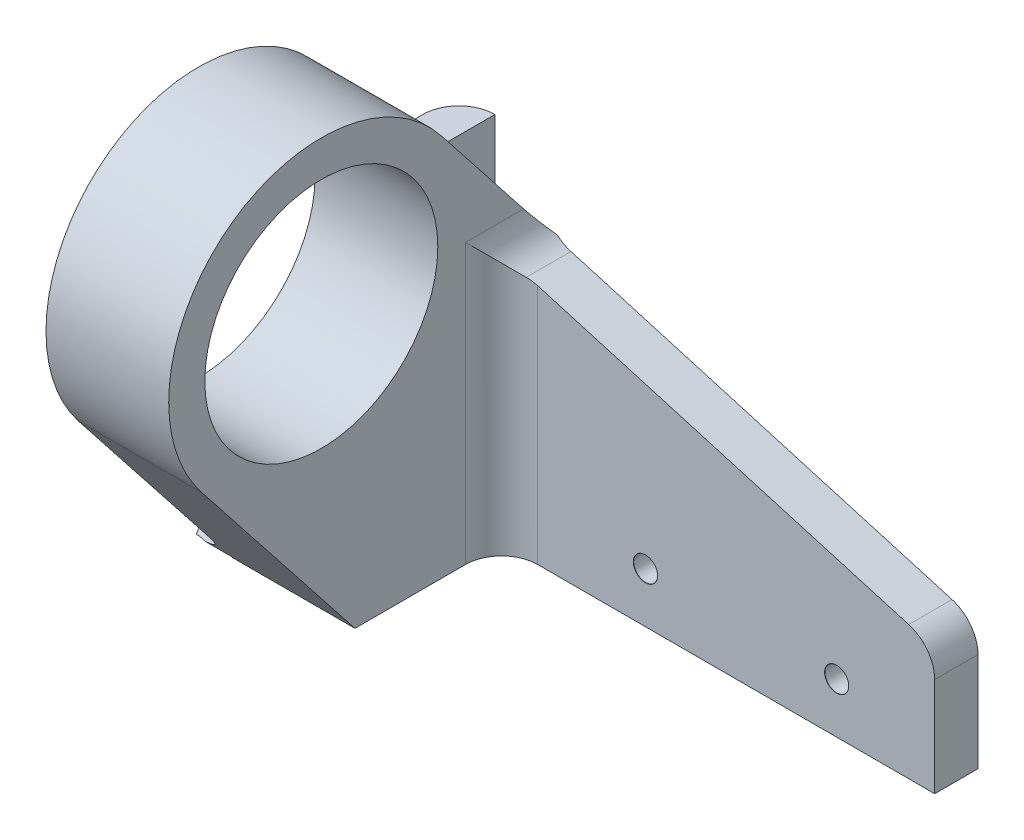
ISO-10303-21;
HEADER;
FILE_DESCRIPTION(('STEP AP214'),'2;1');
FILE_NAME('part.step','',(''),(''),'','','');
FILE_SCHEMA(('AUTOMOTIVE_DESIGN { 1 0 10303 214 1 1 1 1 }'));
ENDSEC;
DATA;
#1=APPLICATION_CONTEXT('core data for automotive mechanical design processes');
#2=APPLICATION_PROTOCOL_DEFINITION('international standard','automotive_design',2000,#1);
#3=PRODUCT_CONTEXT('',#1,'mechanical');
#4=PRODUCT('Part','Part','',(#3));
#5=PRODUCT_RELATED_PRODUCT_CATEGORY('part','',(#4));
#6=PRODUCT_DEFINITION_FORMATION('','',#4);
#7=PRODUCT_DEFINITION_CONTEXT('part definition',#1,'design');
#8=PRODUCT_DEFINITION('design','',#6,#7);
#9=PRODUCT_DEFINITION_SHAPE('','',#8);
#10=(LENGTH_UNIT() NAMED_UNIT(*) SI_UNIT(.MILLI.,.METRE.));
#11=(NAMED_UNIT(*) PLANE_ANGLE_UNIT() SI_UNIT($,.RADIAN.));
#12=(NAMED_UNIT(*) SI_UNIT($,.STERADIAN.) SOLID_ANGLE_UNIT());
#13=UNCERTAINTY_MEASURE_WITH_UNIT(LENGTH_MEASURE(1.E-05),#10,'distance_accuracy_value','');
#14=(GEOMETRIC_REPRESENTATION_CONTEXT(3) GLOBAL_UNCERTAINTY_ASSIGNED_CONTEXT((#13)) GLOBAL_UNIT_ASSIGNED_CONTEXT((#10,
#11,#12)) REPRESENTATION_CONTEXT('',''));
#15=CARTESIAN_POINT('',(0.,0.,0.));
#16=DIRECTION('',(0.,0.,1.));
#17=DIRECTION('',(1.,0.,0.));
#18=AXIS2_PLACEMENT_3D('',#15,#16,#17);
#19=CARTESIAN_POINT('',(0.,0.,0.));
#20=DIRECTION('',(1.,0.,0.));
#21=DIRECTION('',(0.,0.,-1.));
#22=AXIS2_PLACEMENT_3D('',#19,#20,#21);
#23=PLANE('',#22);
#24=CARTESIAN_POINT('',(0.,0.,0.));
#25=DIRECTION('',(1.,0.,0.));
#26=DIRECTION('',(0.,0.,-1.));
#27=AXIS2_PLACEMENT_3D('',#24,#25,#26);
#28=CIRCLE('',#27,16.14);
#29=CARTESIAN_POINT('',(0.,0.,-16.14));
#30=VERTEX_POINT('',#29);
#31=EDGE_CURVE('E338',#30,#30,#28,.T.);
#32=ORIENTED_EDGE('',*,*,#31,.T.);
#33=EDGE_LOOP('',(#32));
#34=FACE_BOUND('',#33,.T.);
#35=DIRECTION('',(0.,-0.785199467037918,-0.619242922416857));
#36=VECTOR('',#35,1.);
#37=CARTESIAN_POINT('',(0.,-5.14237559749537,-30.9785993423039));
#38=LINE('',#37,#36);
#39=CARTESIAN_POINT('',(0.,13.0907953798924,-16.5991167331816));
#40=VERTEX_POINT('',#39);
#41=CARTESIAN_POINT('',(0.,-1.06535646022838,-27.7632822779219));
#42=VERTEX_POINT('',#41);
#43=EDGE_CURVE('E309',#40,#42,#38,.T.);
#44=ORIENTED_EDGE('',*,*,#43,.T.);
#45=DIRECTION('',(0.,0.796277585088125,-0.604931407257239));
#46=VECTOR('',#45,1.);
#47=CARTESIAN_POINT('',(0.,-36.7121846813907,-0.682417057160559));
#48=LINE('',#47,#46);
#49=CARTESIAN_POINT('',(0.,-35.8420059401697,-1.3434911101667));
#50=VERTEX_POINT('',#49);
#51=EDGE_CURVE('E386',#42,#50,#48,.F.);
#52=ORIENTED_EDGE('',*,*,#51,.T.);
#53=DIRECTION('',(0.,0.785199467037918,0.619242922416858));
#54=VECTOR('',#53,1.);
#55=CARTESIAN_POINT('',(0.,-40.0521609353352,-4.66380498260119));
#56=LINE('',#55,#54);
#57=CARTESIAN_POINT('',(0.,-13.0907953798924,16.5991167331816));
#58=VERTEX_POINT('',#57);
#59=EDGE_CURVE('E316',#50,#58,#56,.T.);
#60=ORIENTED_EDGE('',*,*,#59,.T.);
#61=CARTESIAN_POINT('',(0.,0.,0.));
#62=DIRECTION('',(1.,0.,0.));
#63=DIRECTION('',(0.,0.,-1.));
#64=AXIS2_PLACEMENT_3D('',#61,#62,#63);
#65=CIRCLE('',#64,21.14);
#66=EDGE_CURVE('E342',#40,#58,#65,.T.);
#67=ORIENTED_EDGE('',*,*,#66,.F.);
#68=EDGE_LOOP('',(#44,#52,#60,#67));
#69=FACE_BOUND('',#68,.T.);
#70=ADVANCED_FACE('F33',(#34,#69),#23,.F.);
#71=CARTESIAN_POINT('',(0.,-40.0521609353352,-4.66380498260119));
#72=VERTEX_POINT('',#71);
#73=CARTESIAN_POINT('',(0.,-39.7368417176769,-4.41513034381994));
#74=VERTEX_POINT('',#73);
#75=EDGE_CURVE('E313',#72,#74,#56,.T.);
#76=ORIENTED_EDGE('',*,*,#75,.T.);
#77=DIRECTION('',(0.,0.,1.));
#78=VECTOR('',#77,1.);
#79=CARTESIAN_POINT('',(0.,-39.7368417176769,-4.66380498260119));
#80=LINE('',#79,#78);
#81=CARTESIAN_POINT('',(0.,-39.7368417176769,-30.9785993423039));
#82=VERTEX_POINT('',#81);
#83=EDGE_CURVE('E280',#82,#74,#80,.T.);
#84=ORIENTED_EDGE('',*,*,#83,.F.);
#85=DIRECTION('',(0.,-1.,0.));
#86=VECTOR('',#85,1.);
#87=CARTESIAN_POINT('',(0.,-40.0521609353352,-30.9785993423039));
#88=LINE('',#87,#86);
#89=CARTESIAN_POINT('',(0.,-40.0521609353352,-30.9785993423039));
#90=VERTEX_POINT('',#89);
#91=EDGE_CURVE('E308',#82,#90,#88,.T.);
#92=ORIENTED_EDGE('',*,*,#91,.T.);
#93=DIRECTION('',(0.,0.,1.));
#94=VECTOR('',#93,1.);
#95=CARTESIAN_POINT('',(0.,-40.0521609353352,-30.9785993423039));
#96=LINE('',#95,#94);
#97=EDGE_CURVE('E303',#90,#72,#96,.T.);
#98=ORIENTED_EDGE('',*,*,#97,.T.);
#99=EDGE_LOOP('',(#76,#84,#92,#98));
#100=FACE_BOUND('',#99,.T.);
#101=ADVANCED_FACE('F479',(#100),#23,.F.);
#102=CARTESIAN_POINT('',(17.,0.,0.));
#103=DIRECTION('',(-1.,0.,0.));
#104=DIRECTION('',(0.,0.,1.));
#105=AXIS2_PLACEMENT_3D('',#102,#103,#104);
#106=CYLINDRICAL_SURFACE('',#105,21.14);
#107=DIRECTION('',(-1.,0.,0.));
#108=VECTOR('',#107,1.);
#109=CARTESIAN_POINT('',(88.3289062924821,-13.0907953798924,16.5991167331816));
#110=LINE('',#109,#108);
#111=CARTESIAN_POINT('',(17.,-13.0907953798924,16.5991167331816));
#112=VERTEX_POINT('',#111);
#113=EDGE_CURVE('E320',#112,#58,#110,.T.);
#114=ORIENTED_EDGE('',*,*,#113,.F.);
#115=CARTESIAN_POINT('',(17.,0.,0.));
#116=DIRECTION('',(1.,0.,0.));
#117=DIRECTION('',(0.,0.,-1.));
#118=AXIS2_PLACEMENT_3D('',#115,#116,#117);
#119=CIRCLE('',#118,21.14);
#120=CARTESIAN_POINT('',(17.,13.0907953798924,-16.5991167331816));
#121=VERTEX_POINT('',#120);
#122=EDGE_CURVE('E345',#121,#112,#119,.T.);
#123=ORIENTED_EDGE('',*,*,#122,.F.);
#124=DIRECTION('',(-1.,0.,0.));
#125=VECTOR('',#124,1.);
#126=CARTESIAN_POINT('',(88.3289062924821,13.0907953798924,-16.5991167331816));
#127=LINE('',#126,#125);
#128=EDGE_CURVE('E329',#121,#40,#127,.T.);
#129=ORIENTED_EDGE('',*,*,#128,.T.);
#130=ORIENTED_EDGE('',*,*,#66,.T.);
#131=EDGE_LOOP('',(#114,#123,#129,#130));
#132=FACE_BOUND('',#131,.T.);
#133=ADVANCED_FACE('F490',(#132),#106,.T.);
#134=CARTESIAN_POINT('',(17.,0.,0.));
#135=DIRECTION('',(1.,0.,0.));
#136=DIRECTION('',(0.,0.,-1.));
#137=AXIS2_PLACEMENT_3D('',#134,#135,#136);
#138=PLANE('',#137);
#139=DIRECTION('',(0.,-1.,0.));
#140=VECTOR('',#139,1.);
#141=CARTESIAN_POINT('',(17.,0.,-19.9785993423039));
#142=LINE('',#141,#140);
#143=CARTESIAN_POINT('',(17.,-40.0521609353352,-19.9785993423039));
#144=VERTEX_POINT('',#143);
#145=CARTESIAN_POINT('',(17.,-1.38966790727599,-19.9785993423039));
#146=VERTEX_POINT('',#145);
#147=EDGE_CURVE('E363',#144,#146,#142,.F.);
#148=ORIENTED_EDGE('',*,*,#147,.T.);
#149=DIRECTION('',(0.,0.,1.));
#150=VECTOR('',#149,1.);
#151=CARTESIAN_POINT('',(17.,-1.38966790727599,0.));
#152=LINE('',#151,#150);
#153=CARTESIAN_POINT('',(17.,-1.38966790727599,-28.0190485853044));
#154=VERTEX_POINT('',#153);
#155=EDGE_CURVE('E365',#146,#154,#152,.F.);
#156=ORIENTED_EDGE('',*,*,#155,.T.);
#157=DIRECTION('',(0.,-0.785199467037918,-0.619242922416857));
#158=VECTOR('',#157,1.);
#159=CARTESIAN_POINT('',(17.,-5.14237559749537,-30.9785993423039));
#160=LINE('',#159,#158);
#161=EDGE_CURVE('E325',#121,#154,#160,.T.);
#162=ORIENTED_EDGE('',*,*,#161,.F.);
#163=ORIENTED_EDGE('',*,*,#122,.T.);
#164=DIRECTION('',(0.,0.785199467037918,0.619242922416858));
#165=VECTOR('',#164,1.);
#166=CARTESIAN_POINT('',(17.,-40.0521609353352,-4.66380498260119));
#167=LINE('',#166,#165);
#168=CARTESIAN_POINT('',(17.,-40.0521609353352,-4.66380498260119));
#169=VERTEX_POINT('',#168);
#170=EDGE_CURVE('E307',#169,#112,#167,.T.);
#171=ORIENTED_EDGE('',*,*,#170,.F.);
#172=DIRECTION('',(0.,0.,1.));
#173=VECTOR('',#172,1.);
#174=CARTESIAN_POINT('',(17.,-40.0521609353352,-30.9785993423039));
#175=LINE('',#174,#173);
#176=EDGE_CURVE('E321',#144,#169,#175,.T.);
#177=ORIENTED_EDGE('',*,*,#176,.F.);
#178=EDGE_LOOP('',(#148,#156,#162,#163,#171,#177));
#179=FACE_BOUND('',#178,.T.);
#180=CARTESIAN_POINT('',(17.,0.,0.));
#181=DIRECTION('',(1.,0.,0.));
#182=DIRECTION('',(0.,0.,-1.));
#183=AXIS2_PLACEMENT_3D('',#180,#181,#182);
#184=CIRCLE('',#183,16.14);
#185=CARTESIAN_POINT('',(17.,0.,-16.14));
#186=VERTEX_POINT('',#185);
#187=EDGE_CURVE('E339',#186,#186,#184,.T.);
#188=ORIENTED_EDGE('',*,*,#187,.F.);
#189=EDGE_LOOP('',(#188));
#190=FACE_BOUND('',#189,.T.);
#191=ADVANCED_FACE('F485',(#179,#190),#138,.T.);
#192=CARTESIAN_POINT('',(17.,0.,0.));
#193=DIRECTION('',(-1.,0.,0.));
#194=DIRECTION('',(0.,0.,1.));
#195=AXIS2_PLACEMENT_3D('',#192,#193,#194);
#196=CYLINDRICAL_SURFACE('',#195,16.14);
#197=ORIENTED_EDGE('',*,*,#187,.T.);
#198=EDGE_LOOP('',(#197));
#199=FACE_BOUND('',#198,.T.);
#200=ORIENTED_EDGE('',*,*,#31,.F.);
#201=EDGE_LOOP('',(#200));
#202=FACE_BOUND('',#201,.T.);
#203=ADVANCED_FACE('F719',(#199,#202),#196,.F.);
#204=CARTESIAN_POINT('',(88.3289062924821,-40.0521609353352,-4.66380498260119));
#205=DIRECTION('',(0.,-0.619242922416858,0.785199467037918));
#206=DIRECTION('',(0.,-0.785199467037918,-0.619242922416858));
#207=AXIS2_PLACEMENT_3D('',#204,#205,#206);
#208=PLANE('',#207);
#209=DIRECTION('',(-1.,0.,0.));
#210=VECTOR('',#209,1.);
#211=CARTESIAN_POINT('',(88.3289062924821,-40.0521609353352,-4.66380498260119));
#212=LINE('',#211,#210);
#213=EDGE_CURVE('E323',#169,#72,#212,.T.);
#214=ORIENTED_EDGE('',*,*,#213,.F.);
#215=ORIENTED_EDGE('',*,*,#170,.T.);
#216=ORIENTED_EDGE('',*,*,#113,.T.);
#217=ORIENTED_EDGE('',*,*,#59,.F.);
#218=CARTESIAN_POINT('',(-5.,-35.8420059401697,-1.3434911101667));
#219=DIRECTION('',(0.,-0.619242922416858,0.785199467037918));
#220=DIRECTION('',(0.,-0.785199467037918,-0.619242922416858));
#221=AXIS2_PLACEMENT_3D('',#218,#219,#220);
#222=ELLIPSE('',#221,5.16485665987422,5.);
#223=CARTESIAN_POINT('',(-3.60682705738174,-39.7368417176769,-4.41513034381994));
#224=VERTEX_POINT('',#223);
#225=EDGE_CURVE('E390',#50,#224,#222,.F.);
#226=ORIENTED_EDGE('',*,*,#225,.T.);
#227=DIRECTION('',(1.,0.,0.));
#228=VECTOR('',#227,1.);
#229=CARTESIAN_POINT('',(-5.,-39.7368417176769,-4.41513034381994));
#230=LINE('',#229,#228);
#231=EDGE_CURVE('E233',#74,#224,#230,.F.);
#232=ORIENTED_EDGE('',*,*,#231,.F.);
#233=ORIENTED_EDGE('',*,*,#75,.F.);
#234=EDGE_LOOP('',(#214,#215,#216,#217,#226,#232,#233));
#235=FACE_BOUND('',#234,.T.);
#236=ADVANCED_FACE('F481',(#235),#208,.T.);
#237=CARTESIAN_POINT('',(88.3289062924821,-5.14237559749537,-30.9785993423039));
#238=DIRECTION('',(0.,0.619242922416857,-0.785199467037918));
#239=DIRECTION('',(0.,0.785199467037918,0.619242922416857));
#240=AXIS2_PLACEMENT_3D('',#237,#238,#239);
#241=PLANE('',#240);
#242=ORIENTED_EDGE('',*,*,#128,.F.);
#243=ORIENTED_EDGE('',*,*,#161,.T.);
#244=CARTESIAN_POINT('',(22.,-1.38966790727599,-28.0190485853044));
#245=DIRECTION('',(0.,0.619242922416857,-0.785199467037918));
#246=DIRECTION('',(0.,0.785199467037918,0.619242922416857));
#247=AXIS2_PLACEMENT_3D('',#244,#245,#246);
#248=ELLIPSE('',#247,6.36780870326106,5.);
#249=CARTESIAN_POINT('',(18.6958836292031,-5.14237559749537,-30.9785993423039));
#250=VERTEX_POINT('',#249);
#251=EDGE_CURVE('E367',#154,#250,#248,.F.);
#252=ORIENTED_EDGE('',*,*,#251,.T.);
#253=DIRECTION('',(-1.,0.,0.));
#254=VECTOR('',#253,1.);
#255=CARTESIAN_POINT('',(88.3289062924821,-5.14237559749537,-30.9785993423039));
#256=LINE('',#255,#254);
#257=CARTESIAN_POINT('',(0.,-5.14237559749537,-30.9785993423039));
#258=VERTEX_POINT('',#257);
#259=EDGE_CURVE('E328',#250,#258,#256,.T.);
#260=ORIENTED_EDGE('',*,*,#259,.T.);
#261=CARTESIAN_POINT('',(0.,-5.12079915688885,-30.9615832098465));
#262=VERTEX_POINT('',#261);
#263=EDGE_CURVE('E312',#262,#258,#38,.T.);
#264=ORIENTED_EDGE('',*,*,#263,.F.);
#265=DIRECTION('',(1.,0.,0.));
#266=VECTOR('',#265,1.);
#267=CARTESIAN_POINT('',(-5.,-5.12079915688886,-30.9615832098465));
#268=LINE('',#267,#266);
#269=CARTESIAN_POINT('',(-5.,-5.12079915688885,-30.9615832098465));
#270=VERTEX_POINT('',#269);
#271=EDGE_CURVE('E384',#270,#262,#268,.T.);
#272=ORIENTED_EDGE('',*,*,#271,.F.);
#273=CARTESIAN_POINT('',(-5.,-1.06535646022838,-27.7632822779219));
#274=DIRECTION('',(0.,0.619242922416857,-0.785199467037918));
#275=DIRECTION('',(0.,-0.785199467037918,-0.619242922416857));
#276=AXIS2_PLACEMENT_3D('',#273,#274,#275);
#277=ELLIPSE('',#276,5.16485665987422,5.);
#278=EDGE_CURVE('E388',#270,#42,#277,.F.);
#279=ORIENTED_EDGE('',*,*,#278,.T.);
#280=ORIENTED_EDGE('',*,*,#43,.F.);
#281=EDGE_LOOP('',(#242,#243,#252,#260,#264,#272,#279,#280));
#282=FACE_BOUND('',#281,.T.);
#283=ADVANCED_FACE('F495',(#282),#241,.T.);
#284=CARTESIAN_POINT('',(88.3289062924821,-40.0521609353352,-30.9785993423039));
#285=DIRECTION('',(0.,0.,-1.));
#286=DIRECTION('',(-1.,0.,0.));
#287=AXIS2_PLACEMENT_3D('',#284,#285,#286);
#288=PLANE('',#287);
#289=CARTESIAN_POINT('',(36.9325703904823,-33.0951279134987,-30.9785993423039));
#290=DIRECTION('',(0.,0.,-1.));
#291=DIRECTION('',(-1.,0.,0.));
#292=AXIS2_PLACEMENT_3D('',#289,#290,#291);
#293=CIRCLE('',#292,1.65);
#294=CARTESIAN_POINT('',(35.2825703904823,-33.0951279134987,-30.9785993423039));
#295=VERTEX_POINT('',#294);
#296=EDGE_CURVE('E37',#295,#295,#293,.T.);
#297=ORIENTED_EDGE('',*,*,#296,.F.);
#298=EDGE_LOOP('',(#297));
#299=FACE_BOUND('',#298,.T.);
#300=CARTESIAN_POINT('',(63.4183540434603,-33.0951279134987,-30.9785993423039));
#301=DIRECTION('',(0.,0.,-1.));
#302=DIRECTION('',(-1.,0.,0.));
#303=AXIS2_PLACEMENT_3D('',#300,#301,#302);
#304=CIRCLE('',#303,1.65);
#305=CARTESIAN_POINT('',(61.7683540434603,-33.0951279134987,-30.9785993423039));
#306=VERTEX_POINT('',#305);
#307=EDGE_CURVE('E210',#306,#306,#304,.T.);
#308=ORIENTED_EDGE('',*,*,#307,.F.);
#309=EDGE_LOOP('',(#308));
#310=FACE_BOUND('',#309,.T.);
#311=DIRECTION('',(-0.96019380626216,0.279334663827794,0.));
#312=VECTOR('',#311,1.);
#313=CARTESIAN_POINT('',(92.1266073065494,-26.9978233827606,-30.9785993423039));
#314=LINE('',#313,#312);
#315=CARTESIAN_POINT('',(73.396673319139,-21.5490069253238,-30.9785993423039));
#316=VERTEX_POINT('',#315);
#317=CARTESIAN_POINT('',(20.603326680861,-6.19063693858678,-30.9785993423039));
#318=VERTEX_POINT('',#317);
#319=EDGE_CURVE('E289',#316,#318,#314,.T.);
#320=ORIENTED_EDGE('',*,*,#319,.F.);
#321=CARTESIAN_POINT('',(72.,-26.3499759566346,-30.9785993423039));
#322=DIRECTION('',(0.,0.,-1.));
#323=DIRECTION('',(-1.,0.,0.));
#324=AXIS2_PLACEMENT_3D('',#321,#322,#323);
#325=CIRCLE('',#324,5.);
#326=CARTESIAN_POINT('',(77.,-26.3499759566346,-30.9785993423039));
#327=VERTEX_POINT('',#326);
#328=EDGE_CURVE('E361',#316,#327,#325,.T.);
#329=ORIENTED_EDGE('',*,*,#328,.T.);
#330=DIRECTION('',(0.,1.,0.));
#331=VECTOR('',#330,1.);
#332=CARTESIAN_POINT('',(77.,-5.14237559749537,-30.9785993423039));
#333=LINE('',#332,#331);
#334=CARTESIAN_POINT('',(77.,-40.0521609353352,-30.9785993423039));
#335=VERTEX_POINT('',#334);
#336=EDGE_CURVE('E292',#335,#327,#333,.T.);
#337=ORIENTED_EDGE('',*,*,#336,.F.);
#338=DIRECTION('',(-1.,0.,0.));
#339=VECTOR('',#338,1.);
#340=CARTESIAN_POINT('',(88.3289062924821,-40.0521609353352,-30.9785993423039));
#341=LINE('',#340,#339);
#342=EDGE_CURVE('E324',#335,#90,#341,.T.);
#343=ORIENTED_EDGE('',*,*,#342,.T.);
#344=ORIENTED_EDGE('',*,*,#91,.F.);
#345=EDGE_CURVE('E304',#258,#82,#88,.T.);
#346=ORIENTED_EDGE('',*,*,#345,.F.);
#347=ORIENTED_EDGE('',*,*,#259,.F.);
#348=CARTESIAN_POINT('',(22.,-1.38966790727599,-30.9785993423039));
#349=DIRECTION('',(0.,0.,-1.));
#350=DIRECTION('',(-1.,0.,0.));
#351=AXIS2_PLACEMENT_3D('',#348,#349,#350);
#352=CIRCLE('',#351,5.);
#353=EDGE_CURVE('E370',#250,#318,#352,.F.);
#354=ORIENTED_EDGE('',*,*,#353,.T.);
#355=EDGE_LOOP('',(#320,#329,#337,#343,#344,#346,#347,#354));
#356=FACE_BOUND('',#355,.T.);
#357=ADVANCED_FACE('F461',(#299,#310,#356),#288,.T.);
#358=CARTESIAN_POINT('',(88.3289062924821,-40.0521609353352,-30.9785993423039));
#359=DIRECTION('',(0.,-1.,0.));
#360=DIRECTION('',(0.,0.,-1.));
#361=AXIS2_PLACEMENT_3D('',#358,#359,#360);
#362=PLANE('',#361);
#363=ORIENTED_EDGE('',*,*,#342,.F.);
#364=DIRECTION('',(0.,0.,-1.));
#365=VECTOR('',#364,1.);
#366=CARTESIAN_POINT('',(77.,-40.0521609353352,-30.9785993423039));
#367=LINE('',#366,#365);
#368=CARTESIAN_POINT('',(77.,-40.0521609353352,-24.9785993423039));
#369=VERTEX_POINT('',#368);
#370=EDGE_CURVE('E297',#369,#335,#367,.T.);
#371=ORIENTED_EDGE('',*,*,#370,.F.);
#372=DIRECTION('',(-1.,0.,0.));
#373=VECTOR('',#372,1.);
#374=CARTESIAN_POINT('',(77.,-40.0521609353352,-24.9785993423039));
#375=LINE('',#374,#373);
#376=CARTESIAN_POINT('',(22.,-40.0521609353352,-24.9785993423039));
#377=VERTEX_POINT('',#376);
#378=EDGE_CURVE('E300',#369,#377,#375,.T.);
#379=ORIENTED_EDGE('',*,*,#378,.T.);
#380=CARTESIAN_POINT('',(22.,-40.0521609353352,-19.9785993423039));
#381=DIRECTION('',(0.,-1.,0.));
#382=DIRECTION('',(0.,0.,-1.));
#383=AXIS2_PLACEMENT_3D('',#380,#381,#382);
#384=CIRCLE('',#383,5.);
#385=EDGE_CURVE('E372',#377,#144,#384,.F.);
#386=ORIENTED_EDGE('',*,*,#385,.T.);
#387=ORIENTED_EDGE('',*,*,#176,.T.);
#388=ORIENTED_EDGE('',*,*,#213,.T.);
#389=ORIENTED_EDGE('',*,*,#97,.F.);
#390=EDGE_LOOP('',(#363,#371,#379,#386,#387,#388,#389));
#391=FACE_BOUND('',#390,.T.);
#392=ADVANCED_FACE('F441',(#391),#362,.T.);
#393=CARTESIAN_POINT('',(77.,-5.14237559749537,-24.9785993423039));
#394=DIRECTION('',(0.,0.,-1.));
#395=DIRECTION('',(0.,1.,0.));
#396=AXIS2_PLACEMENT_3D('',#393,#394,#395);
#397=PLANE('',#396);
#398=CARTESIAN_POINT('',(36.9325703904823,-33.0951279134987,-24.9785993423039));
#399=DIRECTION('',(0.,0.,1.));
#400=DIRECTION('',(1.,0.,0.));
#401=AXIS2_PLACEMENT_3D('',#398,#399,#400);
#402=CIRCLE('',#401,1.675);
#403=CARTESIAN_POINT('',(38.6075703904823,-33.0951279134987,-24.9785993423039));
#404=VERTEX_POINT('',#403);
#405=EDGE_CURVE('E431',#404,#404,#402,.T.);
#406=ORIENTED_EDGE('',*,*,#405,.F.);
#407=EDGE_LOOP('',(#406));
#408=FACE_BOUND('',#407,.T.);
#409=CARTESIAN_POINT('',(63.4183540434603,-33.0951279134987,-24.9785993423039));
#410=DIRECTION('',(0.,0.,1.));
#411=DIRECTION('',(1.,0.,0.));
#412=AXIS2_PLACEMENT_3D('',#409,#410,#411);
#413=CIRCLE('',#412,1.675);
#414=CARTESIAN_POINT('',(65.0933540434603,-33.0951279134987,-24.9785993423039));
#415=VERTEX_POINT('',#414);
#416=EDGE_CURVE('E425',#415,#415,#413,.T.);
#417=ORIENTED_EDGE('',*,*,#416,.F.);
#418=EDGE_LOOP('',(#417));
#419=FACE_BOUND('',#418,.T.);
#420=DIRECTION('',(0.,-1.,0.));
#421=VECTOR('',#420,1.);
#422=CARTESIAN_POINT('',(77.,-5.14237559749537,-24.9785993423039));
#423=LINE('',#422,#421);
#424=CARTESIAN_POINT('',(77.,-26.3499759566346,-24.9785993423039));
#425=VERTEX_POINT('',#424);
#426=EDGE_CURVE('E295',#425,#369,#423,.T.);
#427=ORIENTED_EDGE('',*,*,#426,.F.);
#428=CARTESIAN_POINT('',(72.,-26.3499759566346,-24.9785993423039));
#429=DIRECTION('',(0.,0.,-1.));
#430=DIRECTION('',(0.,1.,0.));
#431=AXIS2_PLACEMENT_3D('',#428,#429,#430);
#432=CIRCLE('',#431,5.);
#433=CARTESIAN_POINT('',(73.396673319139,-21.5490069253239,-24.9785993423039));
#434=VERTEX_POINT('',#433);
#435=EDGE_CURVE('E355',#425,#434,#432,.F.);
#436=ORIENTED_EDGE('',*,*,#435,.T.);
#437=DIRECTION('',(0.960193806262159,-0.279334663827794,0.));
#438=VECTOR('',#437,1.);
#439=CARTESIAN_POINT('',(17.,-5.14237559749538,-24.9785993423039));
#440=LINE('',#439,#438);
#441=CARTESIAN_POINT('',(22.,-6.59694998657204,-24.9785993423039));
#442=VERTEX_POINT('',#441);
#443=EDGE_CURVE('E286',#442,#434,#440,.T.);
#444=ORIENTED_EDGE('',*,*,#443,.F.);
#445=DIRECTION('',(0.,-1.,0.));
#446=VECTOR('',#445,1.);
#447=CARTESIAN_POINT('',(22.,-5.14237559749537,-24.9785993423039));
#448=LINE('',#447,#446);
#449=EDGE_CURVE('E353',#442,#377,#448,.T.);
#450=ORIENTED_EDGE('',*,*,#449,.T.);
#451=ORIENTED_EDGE('',*,*,#378,.F.);
#452=EDGE_LOOP('',(#427,#436,#444,#450,#451));
#453=FACE_BOUND('',#452,.T.);
#454=ADVANCED_FACE('F437',(#408,#419,#453),#397,.F.);
#455=CARTESIAN_POINT('',(77.,0.,0.));
#456=DIRECTION('',(-1.,0.,0.));
#457=DIRECTION('',(0.,0.,1.));
#458=AXIS2_PLACEMENT_3D('',#455,#456,#457);
#459=PLANE('',#458);
#460=ORIENTED_EDGE('',*,*,#336,.T.);
#461=DIRECTION('',(0.,0.,1.));
#462=VECTOR('',#461,1.);
#463=CARTESIAN_POINT('',(77.,-26.3499759566346,0.));
#464=LINE('',#463,#462);
#465=EDGE_CURVE('E348',#327,#425,#464,.T.);
#466=ORIENTED_EDGE('',*,*,#465,.T.);
#467=ORIENTED_EDGE('',*,*,#426,.T.);
#468=ORIENTED_EDGE('',*,*,#370,.T.);
#469=EDGE_LOOP('',(#460,#466,#467,#468));
#470=FACE_BOUND('',#469,.T.);
#471=ADVANCED_FACE('F440',(#470),#459,.F.);
#472=CARTESIAN_POINT('',(17.,-5.14237559749538,-54.9785993423039));
#473=DIRECTION('',(-0.279334663827794,-0.960193806262159,0.));
#474=DIRECTION('',(0.96019380626216,-0.279334663827794,0.));
#475=AXIS2_PLACEMENT_3D('',#472,#473,#474);
#476=PLANE('',#475);
#477=ORIENTED_EDGE('',*,*,#443,.T.);
#478=DIRECTION('',(0.,0.,1.));
#479=VECTOR('',#478,1.);
#480=CARTESIAN_POINT('',(73.396673319139,-21.5490069253239,-54.9785993423039));
#481=LINE('',#480,#479);
#482=EDGE_CURVE('E359',#434,#316,#481,.F.);
#483=ORIENTED_EDGE('',*,*,#482,.T.);
#484=ORIENTED_EDGE('',*,*,#319,.T.);
#485=DIRECTION('',(0.,0.,1.));
#486=VECTOR('',#485,1.);
#487=CARTESIAN_POINT('',(20.603326680861,-6.19063693858679,-54.9785993423039));
#488=LINE('',#487,#486);
#489=CARTESIAN_POINT('',(20.603326680861,-6.19063693858679,-24.7795683736146));
#490=VERTEX_POINT('',#489);
#491=EDGE_CURVE('E357',#318,#490,#488,.T.);
#492=ORIENTED_EDGE('',*,*,#491,.T.);
#493=CARTESIAN_POINT('',(22.,-6.59694998657204,-19.9785993423039));
#494=DIRECTION('',(-0.279334663827794,-0.960193806262159,0.));
#495=DIRECTION('',(0.96019380626216,-0.279334663827794,0.));
#496=AXIS2_PLACEMENT_3D('',#493,#494,#495);
#497=ELLIPSE('',#496,5.20728207929604,5.);
#498=EDGE_CURVE('E374',#490,#442,#497,.T.);
#499=ORIENTED_EDGE('',*,*,#498,.T.);
#500=EDGE_LOOP('',(#477,#483,#484,#492,#499));
#501=FACE_BOUND('',#500,.T.);
#502=ADVANCED_FACE('F458',(#501),#476,.F.);
#503=CARTESIAN_POINT('',(72.,-26.3499759566346,0.));
#504=DIRECTION('',(0.,0.,1.));
#505=DIRECTION('',(1.,0.,0.));
#506=AXIS2_PLACEMENT_3D('',#503,#504,#505);
#507=CYLINDRICAL_SURFACE('',#506,5.);
#508=ORIENTED_EDGE('',*,*,#328,.F.);
#509=ORIENTED_EDGE('',*,*,#482,.F.);
#510=ORIENTED_EDGE('',*,*,#435,.F.);
#511=ORIENTED_EDGE('',*,*,#465,.F.);
#512=EDGE_LOOP('',(#508,#509,#510,#511));
#513=FACE_BOUND('',#512,.T.);
#514=ADVANCED_FACE('F454',(#513),#507,.T.);
#515=CARTESIAN_POINT('',(22.,-5.14237559749537,-19.9785993423039));
#516=DIRECTION('',(0.,-1.,0.));
#517=DIRECTION('',(0.,0.,-1.));
#518=AXIS2_PLACEMENT_3D('',#515,#516,#517);
#519=CYLINDRICAL_SURFACE('',#518,5.);
#520=ORIENTED_EDGE('',*,*,#449,.F.);
#521=ORIENTED_EDGE('',*,*,#498,.F.);
#522=CARTESIAN_POINT('',(22.,-1.38966790727599,-19.9785993423039));
#523=DIRECTION('',(0.,-0.707106781186548,0.707106781186547));
#524=DIRECTION('',(0.,-0.707106781186547,-0.707106781186547));
#525=AXIS2_PLACEMENT_3D('',#522,#523,#524);
#526=ELLIPSE('',#525,7.07106781186548,5.);
#527=EDGE_CURVE('E285',#146,#490,#526,.T.);
#528=ORIENTED_EDGE('',*,*,#527,.F.);
#529=ORIENTED_EDGE('',*,*,#147,.F.);
#530=ORIENTED_EDGE('',*,*,#385,.F.);
#531=EDGE_LOOP('',(#520,#521,#528,#529,#530));
#532=FACE_BOUND('',#531,.T.);
#533=ADVANCED_FACE('F471',(#532),#519,.F.);
#534=CARTESIAN_POINT('',(22.,-1.38966790727599,-54.9785993423039));
#535=DIRECTION('',(0.,0.,1.));
#536=DIRECTION('',(1.,0.,0.));
#537=AXIS2_PLACEMENT_3D('',#534,#535,#536);
#538=CYLINDRICAL_SURFACE('',#537,5.);
#539=ORIENTED_EDGE('',*,*,#251,.F.);
#540=ORIENTED_EDGE('',*,*,#155,.F.);
#541=ORIENTED_EDGE('',*,*,#527,.T.);
#542=ORIENTED_EDGE('',*,*,#491,.F.);
#543=ORIENTED_EDGE('',*,*,#353,.F.);
#544=EDGE_LOOP('',(#539,#540,#541,#542,#543));
#545=FACE_BOUND('',#544,.T.);
#546=ADVANCED_FACE('F465',(#545),#538,.F.);
#547=CARTESIAN_POINT('',(-5.,-39.7368417176769,-4.66380498260119));
#548=DIRECTION('',(0.,1.,0.));
#549=DIRECTION('',(0.,0.,1.));
#550=AXIS2_PLACEMENT_3D('',#547,#548,#549);
#551=PLANE('',#550);
#552=DIRECTION('',(0.,0.,1.));
#553=VECTOR('',#552,1.);
#554=CARTESIAN_POINT('',(-5.,-39.7368417176769,-25.5019193282351));
#555=LINE('',#554,#553);
#556=CARTESIAN_POINT('',(-5.,-39.7368417176769,-36.0665139599191));
#557=VERTEX_POINT('',#556);
#558=CARTESIAN_POINT('',(-5.,-39.7368417176769,-4.66380498260119));
#559=VERTEX_POINT('',#558);
#560=EDGE_CURVE('E263',#557,#559,#555,.T.);
#561=ORIENTED_EDGE('',*,*,#560,.F.);
#562=CARTESIAN_POINT('',(0.,-39.7368417176769,-36.0665139599191));
#563=DIRECTION('',(0.,1.,0.));
#564=DIRECTION('',(0.,0.,1.));
#565=AXIS2_PLACEMENT_3D('',#562,#563,#564);
#566=CIRCLE('',#565,5.);
#567=CARTESIAN_POINT('',(0.,-39.7368417176769,-41.0665139599191));
#568=VERTEX_POINT('',#567);
#569=EDGE_CURVE('E380',#557,#568,#566,.F.);
#570=ORIENTED_EDGE('',*,*,#569,.T.);
#571=EDGE_CURVE('E276',#568,#82,#80,.T.);
#572=ORIENTED_EDGE('',*,*,#571,.T.);
#573=ORIENTED_EDGE('',*,*,#83,.T.);
#574=ORIENTED_EDGE('',*,*,#231,.T.);
#575=CARTESIAN_POINT('',(-5.,-39.7368417176769,1.61541233261012));
#576=DIRECTION('',(0.,1.,0.));
#577=DIRECTION('',(0.,0.,1.));
#578=AXIS2_PLACEMENT_3D('',#575,#576,#577);
#579=ELLIPSE('',#578,6.27921731521131,5.);
#580=EDGE_CURVE('E391',#224,#559,#579,.T.);
#581=ORIENTED_EDGE('',*,*,#580,.T.);
#582=EDGE_LOOP('',(#561,#570,#572,#573,#574,#581));
#583=FACE_BOUND('',#582,.T.);
#584=ADVANCED_FACE('F397',(#583),#551,.F.);
#585=CARTESIAN_POINT('',(-5.,-5.09840064244887,-30.9785993423039));
#586=DIRECTION('',(0.,-0.604931407257239,-0.796277585088125));
#587=DIRECTION('',(0.,0.796277585088125,-0.604931407257239));
#588=AXIS2_PLACEMENT_3D('',#585,#586,#587);
#589=PLANE('',#588);
#590=DIRECTION('',(0.,0.796277585088125,-0.604931407257239));
#591=VECTOR('',#590,1.);
#592=CARTESIAN_POINT('',(-5.,-5.09840064244887,-30.9785993423039));
#593=LINE('',#592,#591);
#594=CARTESIAN_POINT('',(-5.,-5.09840064244887,-30.9785993423039));
#595=VERTEX_POINT('',#594);
#596=EDGE_CURVE('E265',#270,#595,#593,.T.);
#597=ORIENTED_EDGE('',*,*,#596,.F.);
#598=ORIENTED_EDGE('',*,*,#271,.T.);
#599=DIRECTION('',(0.,0.796277585088125,-0.604931407257239));
#600=VECTOR('',#599,1.);
#601=CARTESIAN_POINT('',(0.,-5.09840064244887,-30.9785993423039));
#602=LINE('',#601,#600);
#603=CARTESIAN_POINT('',(0.,-5.09840064244887,-30.9785993423039));
#604=VERTEX_POINT('',#603);
#605=EDGE_CURVE('E279',#262,#604,#602,.T.);
#606=ORIENTED_EDGE('',*,*,#605,.T.);
#607=DIRECTION('',(1.,0.,0.));
#608=VECTOR('',#607,1.);
#609=CARTESIAN_POINT('',(-5.,-5.09840064244887,-30.9785993423039));
#610=LINE('',#609,#608);
#611=EDGE_CURVE('E273',#595,#604,#610,.T.);
#612=ORIENTED_EDGE('',*,*,#611,.F.);
#613=EDGE_LOOP('',(#597,#598,#606,#612));
#614=FACE_BOUND('',#613,.T.);
#615=ADVANCED_FACE('F498',(#614),#589,.F.);
#616=CARTESIAN_POINT('',(-5.,-5.09840064244887,-30.9785993423039));
#617=DIRECTION('',(0.,-1.,0.));
#618=DIRECTION('',(0.,0.,-1.));
#619=AXIS2_PLACEMENT_3D('',#616,#617,#618);
#620=PLANE('',#619);
#621=DIRECTION('',(0.,0.,-1.));
#622=VECTOR('',#621,1.);
#623=CARTESIAN_POINT('',(0.,-5.09840064244887,-30.9785993423039));
#624=LINE('',#623,#622);
#625=CARTESIAN_POINT('',(0.,-5.09840064244887,-41.0665139599191));
#626=VERTEX_POINT('',#625);
#627=EDGE_CURVE('E266',#604,#626,#624,.T.);
#628=ORIENTED_EDGE('',*,*,#627,.T.);
#629=CARTESIAN_POINT('',(0.,-5.09840064244887,-36.0665139599191));
#630=DIRECTION('',(0.,-1.,0.));
#631=DIRECTION('',(0.,0.,-1.));
#632=AXIS2_PLACEMENT_3D('',#629,#630,#631);
#633=CIRCLE('',#632,5.);
#634=CARTESIAN_POINT('',(-5.,-5.09840064244887,-36.0665139599191));
#635=VERTEX_POINT('',#634);
#636=EDGE_CURVE('E382',#626,#635,#633,.F.);
#637=ORIENTED_EDGE('',*,*,#636,.T.);
#638=DIRECTION('',(0.,0.,-1.));
#639=VECTOR('',#638,1.);
#640=CARTESIAN_POINT('',(-5.,-5.09840064244887,-30.9785993423039));
#641=LINE('',#640,#639);
#642=EDGE_CURVE('E270',#595,#635,#641,.T.);
#643=ORIENTED_EDGE('',*,*,#642,.F.);
#644=ORIENTED_EDGE('',*,*,#611,.T.);
#645=EDGE_LOOP('',(#628,#637,#643,#644));
#646=FACE_BOUND('',#645,.T.);
#647=ADVANCED_FACE('F418',(#646),#620,.F.);
#648=CARTESIAN_POINT('',(-5.,0.,0.));
#649=DIRECTION('',(1.,0.,0.));
#650=DIRECTION('',(0.,0.,-1.));
#651=AXIS2_PLACEMENT_3D('',#648,#649,#650);
#652=PLANE('',#651);
#653=DIRECTION('',(0.,-1.,0.));
#654=VECTOR('',#653,1.);
#655=CARTESIAN_POINT('',(-5.,0.,-36.0665139599191));
#656=LINE('',#655,#654);
#657=CARTESIAN_POINT('',(-5.,-13.2951970931989,-36.0665139599191));
#658=VERTEX_POINT('',#657);
#659=EDGE_CURVE('E378',#635,#658,#656,.T.);
#660=ORIENTED_EDGE('',*,*,#659,.T.);
#661=CARTESIAN_POINT('',(-5.,-14.7012785400326,-35.1562612670529));
#662=DIRECTION('',(-1.,0.,0.));
#663=DIRECTION('',(0.,0.,1.));
#664=AXIS2_PLACEMENT_3D('',#661,#662,#663);
#665=CIRCLE('',#664,1.675);
#666=CARTESIAN_POINT('',(-5.,-16.1073599868663,-36.0665139599191));
#667=VERTEX_POINT('',#666);
#668=EDGE_CURVE('E184',#667,#658,#665,.T.);
#669=ORIENTED_EDGE('',*,*,#668,.F.);
#670=CARTESIAN_POINT('',(-5.,-32.7006095472992,-36.0665139599191));
#671=VERTEX_POINT('',#670);
#672=EDGE_CURVE('E255',#667,#671,#656,.T.);
#673=ORIENTED_EDGE('',*,*,#672,.T.);
#674=CARTESIAN_POINT('',(-5.,-34.1066909941329,-35.1562612670529));
#675=DIRECTION('',(-1.,0.,0.));
#676=DIRECTION('',(0.,0.,1.));
#677=AXIS2_PLACEMENT_3D('',#674,#675,#676);
#678=CIRCLE('',#677,1.675);
#679=CARTESIAN_POINT('',(-5.,-35.5127724409666,-36.0665139599191));
#680=VERTEX_POINT('',#679);
#681=EDGE_CURVE('E245',#680,#671,#678,.T.);
#682=ORIENTED_EDGE('',*,*,#681,.F.);
#683=EDGE_CURVE('E251',#680,#557,#656,.T.);
#684=ORIENTED_EDGE('',*,*,#683,.T.);
#685=ORIENTED_EDGE('',*,*,#560,.T.);
#686=EDGE_CURVE('E267',#559,#270,#593,.T.);
#687=ORIENTED_EDGE('',*,*,#686,.T.);
#688=ORIENTED_EDGE('',*,*,#596,.T.);
#689=ORIENTED_EDGE('',*,*,#642,.T.);
#690=EDGE_LOOP('',(#660,#669,#673,#682,#684,#685,#687,#688,#689));
#691=FACE_BOUND('',#690,.T.);
#692=ADVANCED_FACE('F253',(#691),#652,.F.);
#693=CARTESIAN_POINT('',(0.,0.,0.));
#694=DIRECTION('',(1.,0.,0.));
#695=DIRECTION('',(0.,0.,-1.));
#696=AXIS2_PLACEMENT_3D('',#693,#694,#695);
#697=PLANE('',#696);
#698=CARTESIAN_POINT('',(0.,-14.7012785400326,-35.1562612670529));
#699=DIRECTION('',(-1.,0.,0.));
#700=DIRECTION('',(0.,0.,1.));
#701=AXIS2_PLACEMENT_3D('',#698,#699,#700);
#702=CIRCLE('',#701,1.65);
#703=CARTESIAN_POINT('',(0.,-14.7012785400326,-33.5062612670529));
#704=VERTEX_POINT('',#703);
#705=EDGE_CURVE('E193',#704,#704,#702,.T.);
#706=ORIENTED_EDGE('',*,*,#705,.T.);
#707=EDGE_LOOP('',(#706));
#708=FACE_BOUND('',#707,.T.);
#709=CARTESIAN_POINT('',(0.,-34.1066909941329,-35.1562612670529));
#710=DIRECTION('',(-1.,0.,0.));
#711=DIRECTION('',(0.,0.,1.));
#712=AXIS2_PLACEMENT_3D('',#709,#710,#711);
#713=CIRCLE('',#712,1.65);
#714=CARTESIAN_POINT('',(0.,-34.1066909941329,-33.5062612670529));
#715=VERTEX_POINT('',#714);
#716=EDGE_CURVE('E247',#715,#715,#713,.T.);
#717=ORIENTED_EDGE('',*,*,#716,.T.);
#718=EDGE_LOOP('',(#717));
#719=FACE_BOUND('',#718,.T.);
#720=ORIENTED_EDGE('',*,*,#605,.F.);
#721=ORIENTED_EDGE('',*,*,#263,.T.);
#722=ORIENTED_EDGE('',*,*,#345,.T.);
#723=ORIENTED_EDGE('',*,*,#571,.F.);
#724=DIRECTION('',(0.,-1.,0.));
#725=VECTOR('',#724,1.);
#726=CARTESIAN_POINT('',(0.,-5.09840064244887,-41.0665139599191));
#727=LINE('',#726,#725);
#728=EDGE_CURVE('E262',#626,#568,#727,.T.);
#729=ORIENTED_EDGE('',*,*,#728,.F.);
#730=ORIENTED_EDGE('',*,*,#627,.F.);
#731=EDGE_LOOP('',(#720,#721,#722,#723,#729,#730));
#732=FACE_BOUND('',#731,.T.);
#733=ADVANCED_FACE('F411',(#708,#719,#732),#697,.T.);
#734=CARTESIAN_POINT('',(0.,0.,-36.0665139599191));
#735=DIRECTION('',(0.,-1.,0.));
#736=DIRECTION('',(0.,0.,-1.));
#737=AXIS2_PLACEMENT_3D('',#734,#735,#736);
#738=CYLINDRICAL_SURFACE('',#737,5.);
#739=CARTESIAN_POINT('',(-4.99013125255214,-13.1485921335942,-35.7525233831459));
#740=CARTESIAN_POINT('',(-4.99272627883733,-13.1610871624393,-35.7936996278648));
#741=CARTESIAN_POINT('',(-4.99475781851407,-13.1758264474867,-35.8341868643061));
#742=CARTESIAN_POINT('',(-4.99781156502614,-13.2094787919129,-35.9134099341133));
#743=CARTESIAN_POINT('',(-4.99883421706721,-13.2283900057751,-35.9521465327999));
#744=CARTESIAN_POINT('',(-5.00049420353154,-13.2882760050147,-36.0604267057544));
#745=CARTESIAN_POINT('',(-5.00001639310766,-13.3341026830495,-36.127353173725));
#746=CARTESIAN_POINT('',(-4.99694604263818,-13.4367408227092,-36.2521339557727));
#747=CARTESIAN_POINT('',(-4.99435016280634,-13.4935695243836,-36.309973770062));
#748=CARTESIAN_POINT('',(-4.98910535250436,-13.5955903965786,-36.3983111687323));
#749=CARTESIAN_POINT('',(-4.98675398833764,-13.6384724800928,-36.4315489787964));
#750=CARTESIAN_POINT('',(-4.98183789709841,-13.7273662742855,-36.4934232882216));
#751=CARTESIAN_POINT('',(-4.97927332591888,-13.7733756939018,-36.5220631054099));
#752=CARTESIAN_POINT('',(-4.97210029609417,-13.9065521261456,-36.5961790370314));
#753=CARTESIAN_POINT('',(-4.96752853048367,-13.9967176651385,-36.6363672973272));
#754=CARTESIAN_POINT('',(-4.95963664680327,-14.1825755364665,-36.7013977471571));
#755=CARTESIAN_POINT('',(-4.95631911953505,-14.2782788429902,-36.7262082386222));
#756=CARTESIAN_POINT('',(-4.95163438816901,-14.4730529316016,-36.7605025556018));
#757=CARTESIAN_POINT('',(-4.95027947562828,-14.5721409919469,-36.7698898366074));
#758=CARTESIAN_POINT('',(-4.94983128235646,-14.7705236918936,-36.7730341724031));
#759=CARTESIAN_POINT('',(-4.9507372116168,-14.8698182472243,-36.7667966869706));
#760=CARTESIAN_POINT('',(-4.9547432555105,-15.0717839930204,-36.7378937641847));
#761=CARTESIAN_POINT('',(-4.95796591008183,-15.1743234641372,-36.7143090816666));
#762=CARTESIAN_POINT('',(-4.96598825459961,-15.3738272491742,-36.6496265242936));
#763=CARTESIAN_POINT('',(-4.9707894303318,-15.4707862090038,-36.6085121387119));
#764=CARTESIAN_POINT('',(-4.98045408495645,-15.6518045944307,-36.51079997187));
#765=CARTESIAN_POINT('',(-4.98530800623347,-15.7362174664932,-36.4548610720011));
#766=CARTESIAN_POINT('',(-4.99358817825919,-15.8922171666939,-36.3274981771448));
#767=CARTESIAN_POINT('',(-4.99702026582017,-15.9638557304506,-36.2561393578554));
#768=CARTESIAN_POINT('',(-4.99990764729575,-16.068322681579,-36.1262256348552));
#769=CARTESIAN_POINT('',(-5.00032036911339,-16.10605250154,-36.0716116589671));
#770=CARTESIAN_POINT('',(-4.99913423029912,-16.1728344706245,-35.9569738888719));
#771=CARTESIAN_POINT('',(-4.99752487945451,-16.2018403909472,-35.8969233951639));
#772=CARTESIAN_POINT('',(-4.99462624136225,-16.2256957878396,-35.8347625648951));
#773=B_SPLINE_CURVE_WITH_KNOTS('',3,(#739,#740,#741,#742,#743,#744,#745,#746,#747,#748,#749,
#750,#751,#752,#753,#754,#755,#756,#757,#758,#759,#760,#761,#762,#763,#764,#765,#766,#767,#768,
#769,#770,#771,#772),.UNSPECIFIED.,.F.,.F.,(4,2,2,2,2,2,2,2,2,2,2,2,2,2,2,2,4),(0.,
0.129186971788866,0.258316909927998,0.500139792059865,0.742344720729558,0.904983686485255,
1.0675047622955,1.36240508592179,1.6579112809926,1.95526030177824,2.25250543410244,
2.56675250317748,2.88129620871738,3.18369914210041,3.48484806752998,3.68322641559511,
3.88263818349652),.UNSPECIFIED.);
#774=CARTESIAN_POINT('',(-4.97902250922057,-13.7784204459163,-36.5240452186052));
#775=VERTEX_POINT('',#774);
#776=EDGE_CURVE('E11',#658,#775,#773,.T.);
#777=ORIENTED_EDGE('',*,*,#776,.F.);
#778=ORIENTED_EDGE('',*,*,#659,.F.);
#779=ORIENTED_EDGE('',*,*,#636,.F.);
#780=ORIENTED_EDGE('',*,*,#728,.T.);
#781=ORIENTED_EDGE('',*,*,#569,.F.);
#782=ORIENTED_EDGE('',*,*,#683,.F.);
#783=CARTESIAN_POINT('',(-4.99013125255214,-32.5540045876945,-35.7525233831458));
#784=CARTESIAN_POINT('',(-4.99272627883733,-32.5664996165396,-35.7936996278648));
#785=CARTESIAN_POINT('',(-4.99475781851407,-32.581238901587,-35.8341868643061));
#786=CARTESIAN_POINT('',(-4.99781156502614,-32.6148912460132,-35.9134099341133));
#787=CARTESIAN_POINT('',(-4.99883421706721,-32.6338024598754,-35.9521465328));
#788=CARTESIAN_POINT('',(-5.00049420353154,-32.693688459115,-36.0604267057544));
#789=CARTESIAN_POINT('',(-5.00001639310766,-32.7395151371498,-36.127353173725));
#790=CARTESIAN_POINT('',(-4.99694604263818,-32.8421532768095,-36.2521339557727));
#791=CARTESIAN_POINT('',(-4.99435016280634,-32.8989819784839,-36.309973770062));
#792=CARTESIAN_POINT('',(-4.98910535250436,-33.0010028506789,-36.3983111687322));
#793=CARTESIAN_POINT('',(-4.98675398833764,-33.0438849341931,-36.4315489787964));
#794=CARTESIAN_POINT('',(-4.98183789709841,-33.1327787283858,-36.4934232882216));
#795=CARTESIAN_POINT('',(-4.97927332591888,-33.1787881480021,-36.5220631054099));
#796=CARTESIAN_POINT('',(-4.97210029609417,-33.3119645802459,-36.5961790370314));
#797=CARTESIAN_POINT('',(-4.96752853048367,-33.4021301192388,-36.6363672973272));
#798=CARTESIAN_POINT('',(-4.95963664680327,-33.5879879905668,-36.7013977471571));
#799=CARTESIAN_POINT('',(-4.95631911953505,-33.6836912970905,-36.7262082386222));
#800=CARTESIAN_POINT('',(-4.95163438816901,-33.8784653857019,-36.7605025556018));
#801=CARTESIAN_POINT('',(-4.95027947562828,-33.9775534460472,-36.7698898366074));
#802=CARTESIAN_POINT('',(-4.94983128235646,-34.1759361459939,-36.7730341724031));
#803=CARTESIAN_POINT('',(-4.95073721161681,-34.2752307013246,-36.7667966869706));
#804=CARTESIAN_POINT('',(-4.9547432555105,-34.4771964471207,-36.7378937641847));
#805=CARTESIAN_POINT('',(-4.95796591008183,-34.5797359182375,-36.7143090816666));
#806=CARTESIAN_POINT('',(-4.96598825459961,-34.7792397032745,-36.6496265242935));
#807=CARTESIAN_POINT('',(-4.9707894303318,-34.8761986631041,-36.6085121387119));
#808=CARTESIAN_POINT('',(-4.98045408495645,-35.057217048531,-36.51079997187));
#809=CARTESIAN_POINT('',(-4.98530800623347,-35.1416299205935,-36.4548610720011));
#810=CARTESIAN_POINT('',(-4.99358817825919,-35.2976296207942,-36.3274981771448));
#811=CARTESIAN_POINT('',(-4.99702026582017,-35.3692681845509,-36.2561393578554));
#812=CARTESIAN_POINT('',(-4.99990764729575,-35.4737351356793,-36.1262256348552));
#813=CARTESIAN_POINT('',(-5.00032036911339,-35.5114649556403,-36.0716116589671));
#814=CARTESIAN_POINT('',(-4.99913423029912,-35.5782469247248,-35.9569738888719));
#815=CARTESIAN_POINT('',(-4.99752487945451,-35.6072528450475,-35.8969233951639));
#816=CARTESIAN_POINT('',(-4.99462624136225,-35.6311082419399,-35.8347625648951));
#817=B_SPLINE_CURVE_WITH_KNOTS('',3,(#783,#784,#785,#786,#787,#788,#789,#790,#791,#792,#793,
#794,#795,#796,#797,#798,#799,#800,#801,#802,#803,#804,#805,#806,#807,#808,#809,#810,#811,#812,
#813,#814,#815,#816),.UNSPECIFIED.,.F.,.F.,(4,2,2,2,2,2,2,2,2,2,2,2,2,2,2,2,4),(0.,
0.129186971788871,0.25831690992801,0.50013979205987,0.742344720729555,0.904983686485251,
1.0675047622955,1.36240508592179,1.65791128099261,1.95526030177824,2.25250543410245,
2.5667525031775,2.8812962087174,3.18369914210044,3.48484806752999,3.68322641559512,
3.88263818349652),.UNSPECIFIED.);
#818=CARTESIAN_POINT('',(-4.97902250922056,-35.0295490882492,-36.5240452186053));
#819=VERTEX_POINT('',#818);
#820=EDGE_CURVE('E226',#819,#680,#817,.T.);
#821=ORIENTED_EDGE('',*,*,#820,.F.);
#822=CARTESIAN_POINT('',(-4.97902250922057,-33.1838329000166,-36.5240452186052));
#823=CARTESIAN_POINT('',(-4.97664374002868,-33.2221796292536,-36.5499172059799));
#824=CARTESIAN_POINT('',(-4.97421400220145,-33.2615935759918,-36.5741630077713));
#825=CARTESIAN_POINT('',(-4.96940479169727,-33.3423189441468,-36.6192635565266));
#826=CARTESIAN_POINT('',(-4.96702531906267,-33.383630367162,-36.6401183006335));
#827=CARTESIAN_POINT('',(-4.9601961456313,-33.5099529013649,-36.6973414689517));
#828=CARTESIAN_POINT('',(-4.95604916951718,-33.5974466207721,-36.7284323643414));
#829=CARTESIAN_POINT('',(-4.94953107294072,-33.7764902980587,-36.7755368629155));
#830=CARTESIAN_POINT('',(-4.9471612067112,-33.8680430725267,-36.7915398195142));
#831=CARTESIAN_POINT('',(-4.94472606290481,-34.0525572022948,-36.8079690049979));
#832=CARTESIAN_POINT('',(-4.94466011581541,-34.1455181405303,-36.8083997591231));
#833=CARTESIAN_POINT('',(-4.94683714982553,-34.3294668538144,-36.7937373769651));
#834=CARTESIAN_POINT('',(-4.94906301030247,-34.420464149582,-36.7787593504869));
#835=CARTESIAN_POINT('',(-4.95531179431345,-34.5986337103833,-36.7338916100742));
#836=CARTESIAN_POINT('',(-4.95933385624985,-34.6858077873384,-36.7040090447115));
#837=CARTESIAN_POINT('',(-4.96620220540297,-34.8151950695326,-36.6472297380589));
#838=CARTESIAN_POINT('',(-4.96873919261597,-34.8596569664774,-36.6252738149995));
#839=CARTESIAN_POINT('',(-4.973877506864,-34.9463335359838,-36.5775079011201));
#840=CARTESIAN_POINT('',(-4.97647868695854,-34.9885527491814,-36.551706134272));
#841=CARTESIAN_POINT('',(-4.97902250922057,-35.0295490882492,-36.5240452186052));
#842=B_SPLINE_CURVE_WITH_KNOTS('',3,(#822,#823,#824,#825,#826,#827,#828,#829,#830,#831,#832,
#833,#834,#835,#836,#837,#838,#839,#840,#841),.UNSPECIFIED.,.F.,.F.,(4,2,2,2,2,2,2,2,2,4),(0.,
0.13887332078643,0.277746758566439,0.555156158300786,0.832761161780829,1.11028549334359,
1.38575155559334,1.66108562462584,1.80986553789307,1.95833174648975),.UNSPECIFIED.);
#843=CARTESIAN_POINT('',(-4.97902250922057,-33.1838329000166,-36.5240452186052));
#844=VERTEX_POINT('',#843);
#845=EDGE_CURVE('E232',#844,#819,#842,.T.);
#846=ORIENTED_EDGE('',*,*,#845,.F.);
#847=EDGE_CURVE('E198',#671,#844,#817,.T.);
#848=ORIENTED_EDGE('',*,*,#847,.F.);
#849=ORIENTED_EDGE('',*,*,#672,.F.);
#850=CARTESIAN_POINT('',(-4.97902250922056,-15.6241366341489,-36.5240452186053));
#851=VERTEX_POINT('',#850);
#852=EDGE_CURVE('E44',#851,#667,#773,.T.);
#853=ORIENTED_EDGE('',*,*,#852,.F.);
#854=CARTESIAN_POINT('',(-4.97902250922057,-13.7784204459163,-36.5240452186052));
#855=CARTESIAN_POINT('',(-4.97664374002868,-13.8167671751533,-36.5499172059799));
#856=CARTESIAN_POINT('',(-4.97421400220145,-13.8561811218916,-36.5741630077713));
#857=CARTESIAN_POINT('',(-4.96940479169727,-13.9369064900465,-36.6192635565266));
#858=CARTESIAN_POINT('',(-4.96702531906267,-13.9782179130618,-36.6401183006335));
#859=CARTESIAN_POINT('',(-4.9601961456313,-14.1045404472646,-36.6973414689517));
#860=CARTESIAN_POINT('',(-4.95604916951718,-14.1920341666718,-36.7284323643414));
#861=CARTESIAN_POINT('',(-4.94953107294072,-14.3710778439584,-36.7755368629155));
#862=CARTESIAN_POINT('',(-4.9471612067112,-14.4626306184264,-36.7915398195142));
#863=CARTESIAN_POINT('',(-4.94472606290481,-14.6471447481945,-36.8079690049979));
#864=CARTESIAN_POINT('',(-4.94466011581541,-14.74010568643,-36.8083997591231));
#865=CARTESIAN_POINT('',(-4.94683714982553,-14.9240543997141,-36.7937373769651));
#866=CARTESIAN_POINT('',(-4.94906301030247,-15.0150516954818,-36.7787593504869));
#867=CARTESIAN_POINT('',(-4.95531179431345,-15.193221256283,-36.7338916100742));
#868=CARTESIAN_POINT('',(-4.95933385624985,-15.2803953332382,-36.7040090447115));
#869=CARTESIAN_POINT('',(-4.96620220540297,-15.4097826154323,-36.6472297380589));
#870=CARTESIAN_POINT('',(-4.96873919261597,-15.4542445123771,-36.6252738149994));
#871=CARTESIAN_POINT('',(-4.973877506864,-15.5409210818835,-36.57750790112));
#872=CARTESIAN_POINT('',(-4.97647868695854,-15.5831402950811,-36.551706134272));
#873=CARTESIAN_POINT('',(-4.97902250922057,-15.6241366341489,-36.5240452186052));
#874=B_SPLINE_CURVE_WITH_KNOTS('',3,(#854,#855,#856,#857,#858,#859,#860,#861,#862,#863,#864,
#865,#866,#867,#868,#869,#870,#871,#872,#873),.UNSPECIFIED.,.F.,.F.,(4,2,2,2,2,2,2,2,2,4),(0.,
0.138873320786427,0.277746758566443,0.555156158300789,0.832761161780834,1.1102854933436,
1.38575155559334,1.66108562462585,1.80986553789306,1.95833174648973),.UNSPECIFIED.);
#875=EDGE_CURVE('E42',#775,#851,#874,.T.);
#876=ORIENTED_EDGE('',*,*,#875,.F.);
#877=EDGE_LOOP('',(#777,#778,#779,#780,#781,#782,#821,#846,#848,#849,#853,#876));
#878=FACE_BOUND('',#877,.T.);
#879=ADVANCED_FACE('F195',(#878),#738,.T.);
#880=CARTESIAN_POINT('',(-5.,-2.07374360616267,-26.9972114168632));
#881=DIRECTION('',(0.,-0.796277585088125,0.604931407257239));
#882=DIRECTION('',(0.,-0.604931407257239,-0.796277585088125));
#883=AXIS2_PLACEMENT_3D('',#880,#881,#882);
#884=CYLINDRICAL_SURFACE('',#883,5.);
#885=ORIENTED_EDGE('',*,*,#225,.F.);
#886=ORIENTED_EDGE('',*,*,#51,.F.);
#887=ORIENTED_EDGE('',*,*,#278,.F.);
#888=ORIENTED_EDGE('',*,*,#686,.F.);
#889=ORIENTED_EDGE('',*,*,#580,.F.);
#890=EDGE_LOOP('',(#885,#886,#887,#888,#889));
#891=FACE_BOUND('',#890,.T.);
#892=ADVANCED_FACE('F35',(#891),#884,.F.);
#893=CARTESIAN_POINT('',(-5.,-34.1066909941329,-35.1562612670529));
#894=DIRECTION('',(-1.,0.,0.));
#895=DIRECTION('',(0.,0.,1.));
#896=AXIS2_PLACEMENT_3D('',#893,#894,#895);
#897=CYLINDRICAL_SURFACE('',#896,1.65);
#898=ORIENTED_EDGE('',*,*,#845,.T.);
#899=CARTESIAN_POINT('',(-4.97902250922057,-34.1066909941329,-35.1562612670529));
#900=DIRECTION('',(-1.,0.,0.));
#901=DIRECTION('',(0.,0.,1.));
#902=AXIS2_PLACEMENT_3D('',#899,#900,#901);
#903=CIRCLE('',#902,1.65);
#904=EDGE_CURVE('E58',#819,#844,#903,.T.);
#905=ORIENTED_EDGE('',*,*,#904,.T.);
#906=EDGE_LOOP('',(#898,#905));
#907=FACE_BOUND('',#906,.T.);
#908=ORIENTED_EDGE('',*,*,#716,.F.);
#909=EDGE_LOOP('',(#908));
#910=FACE_BOUND('',#909,.T.);
#911=ADVANCED_FACE('F222',(#907,#910),#897,.F.);
#912=CARTESIAN_POINT('',(-5.,-34.1066909941329,-35.1562612670529));
#913=DIRECTION('',(-1.,0.,0.));
#914=DIRECTION('',(0.,0.,1.));
#915=AXIS2_PLACEMENT_3D('',#912,#913,#914);
#916=CONICAL_SURFACE('',#915,1.675,0.872664625997227);
#917=ORIENTED_EDGE('',*,*,#847,.T.);
#918=ORIENTED_EDGE('',*,*,#904,.F.);
#919=ORIENTED_EDGE('',*,*,#820,.T.);
#920=ORIENTED_EDGE('',*,*,#681,.T.);
#921=EDGE_LOOP('',(#917,#918,#919,#920));
#922=FACE_BOUND('',#921,.T.);
#923=ADVANCED_FACE('F216',(#922),#916,.F.);
#924=CARTESIAN_POINT('',(-5.,-14.7012785400326,-35.1562612670529));
#925=DIRECTION('',(-1.,0.,0.));
#926=DIRECTION('',(0.,0.,1.));
#927=AXIS2_PLACEMENT_3D('',#924,#925,#926);
#928=CYLINDRICAL_SURFACE('',#927,1.65);
#929=ORIENTED_EDGE('',*,*,#875,.T.);
#930=CARTESIAN_POINT('',(-4.97902250922057,-14.7012785400326,-35.1562612670529));
#931=DIRECTION('',(-1.,0.,0.));
#932=DIRECTION('',(0.,0.,1.));
#933=AXIS2_PLACEMENT_3D('',#930,#931,#932);
#934=CIRCLE('',#933,1.65);
#935=EDGE_CURVE('E50',#851,#775,#934,.T.);
#936=ORIENTED_EDGE('',*,*,#935,.T.);
#937=EDGE_LOOP('',(#929,#936));
#938=FACE_BOUND('',#937,.T.);
#939=ORIENTED_EDGE('',*,*,#705,.F.);
#940=EDGE_LOOP('',(#939));
#941=FACE_BOUND('',#940,.T.);
#942=ADVANCED_FACE('F190',(#938,#941),#928,.F.);
#943=CARTESIAN_POINT('',(-5.,-14.7012785400326,-35.1562612670529));
#944=DIRECTION('',(-1.,0.,0.));
#945=DIRECTION('',(0.,0.,1.));
#946=AXIS2_PLACEMENT_3D('',#943,#944,#945);
#947=CONICAL_SURFACE('',#946,1.675,0.872664625997159);
#948=ORIENTED_EDGE('',*,*,#776,.T.);
#949=ORIENTED_EDGE('',*,*,#935,.F.);
#950=ORIENTED_EDGE('',*,*,#852,.T.);
#951=ORIENTED_EDGE('',*,*,#668,.T.);
#952=EDGE_LOOP('',(#948,#949,#950,#951));
#953=FACE_BOUND('',#952,.T.);
#954=ADVANCED_FACE('F182',(#953),#947,.F.);
#955=CARTESIAN_POINT('',(63.4183540434603,-33.0951279134987,-24.9785993423039));
#956=DIRECTION('',(0.,0.,1.));
#957=DIRECTION('',(1.,0.,0.));
#958=AXIS2_PLACEMENT_3D('',#955,#956,#957);
#959=CYLINDRICAL_SURFACE('',#958,1.65);
#960=ORIENTED_EDGE('',*,*,#307,.T.);
#961=EDGE_LOOP('',(#960));
#962=FACE_BOUND('',#961,.T.);
#963=CARTESIAN_POINT('',(63.4183540434603,-33.0951279134987,-24.9995768330833));
#964=DIRECTION('',(0.,0.,1.));
#965=DIRECTION('',(1.,0.,0.));
#966=AXIS2_PLACEMENT_3D('',#963,#964,#965);
#967=CIRCLE('',#966,1.65);
#968=CARTESIAN_POINT('',(65.0683540434603,-33.0951279134987,-24.9995768330833));
#969=VERTEX_POINT('',#968);
#970=EDGE_CURVE('E421',#969,#969,#967,.T.);
#971=ORIENTED_EDGE('',*,*,#970,.T.);
#972=EDGE_LOOP('',(#971));
#973=FACE_BOUND('',#972,.T.);
#974=ADVANCED_FACE('F612',(#962,#973),#959,.F.);
#975=CARTESIAN_POINT('',(63.4183540434603,-33.0951279134987,-24.9785993423039));
#976=DIRECTION('',(0.,0.,1.));
#977=DIRECTION('',(1.,0.,0.));
#978=AXIS2_PLACEMENT_3D('',#975,#976,#977);
#979=CONICAL_SURFACE('',#978,1.675,0.87266462599709);
#980=ORIENTED_EDGE('',*,*,#970,.F.);
#981=EDGE_LOOP('',(#980));
#982=FACE_BOUND('',#981,.T.);
#983=ORIENTED_EDGE('',*,*,#416,.T.);
#984=EDGE_LOOP('',(#983));
#985=FACE_BOUND('',#984,.T.);
#986=ADVANCED_FACE('F641',(#982,#985),#979,.F.);
#987=CARTESIAN_POINT('',(36.9325703904823,-33.0951279134987,-24.9785993423039));
#988=DIRECTION('',(0.,0.,1.));
#989=DIRECTION('',(1.,0.,0.));
#990=AXIS2_PLACEMENT_3D('',#987,#988,#989);
#991=CYLINDRICAL_SURFACE('',#990,1.65);
#992=ORIENTED_EDGE('',*,*,#296,.T.);
#993=EDGE_LOOP('',(#992));
#994=FACE_BOUND('',#993,.T.);
#995=CARTESIAN_POINT('',(36.9325703904823,-33.0951279134987,-24.9995768330833));
#996=DIRECTION('',(0.,0.,1.));
#997=DIRECTION('',(1.,0.,0.));
#998=AXIS2_PLACEMENT_3D('',#995,#996,#997);
#999=CIRCLE('',#998,1.65);
#1000=CARTESIAN_POINT('',(38.5825703904823,-33.0951279134987,-24.9995768330833));
#1001=VERTEX_POINT('',#1000);
#1002=EDGE_CURVE('E428',#1001,#1001,#999,.T.);
#1003=ORIENTED_EDGE('',*,*,#1002,.T.);
#1004=EDGE_LOOP('',(#1003));
#1005=FACE_BOUND('',#1004,.T.);
#1006=ADVANCED_FACE('F650',(#994,#1005),#991,.F.);
#1007=CARTESIAN_POINT('',(36.9325703904823,-33.0951279134987,-24.9785993423039));
#1008=DIRECTION('',(0.,0.,1.));
#1009=DIRECTION('',(1.,0.,0.));
#1010=AXIS2_PLACEMENT_3D('',#1007,#1008,#1009);
#1011=CONICAL_SURFACE('',#1010,1.675,0.872664625997227);
#1012=ORIENTED_EDGE('',*,*,#1002,.F.);
#1013=EDGE_LOOP('',(#1012));
#1014=FACE_BOUND('',#1013,.T.);
#1015=ORIENTED_EDGE('',*,*,#405,.T.);
#1016=EDGE_LOOP('',(#1015));
#1017=FACE_BOUND('',#1016,.T.);
#1018=ADVANCED_FACE('F435',(#1014,#1017),#1011,.F.);
#1019=CLOSED_SHELL('',(#70,#101,#133,#191,#203,#236,#283,#357,#392,#454,#471,#502,#514,#533,
#546,#584,#615,#647,#692,#733,#879,#892,#911,#923,#942,#954,#974,#986,#1006,#1018));
#1020=MANIFOLD_SOLID_BREP('B2',#1019);
#1021=ADVANCED_BREP_SHAPE_REPRESENTATION('',(#18,#1020),#14);
#1022=SHAPE_DEFINITION_REPRESENTATION(#9,#1021);
ENDSEC;
END-ISO-10303-21;
